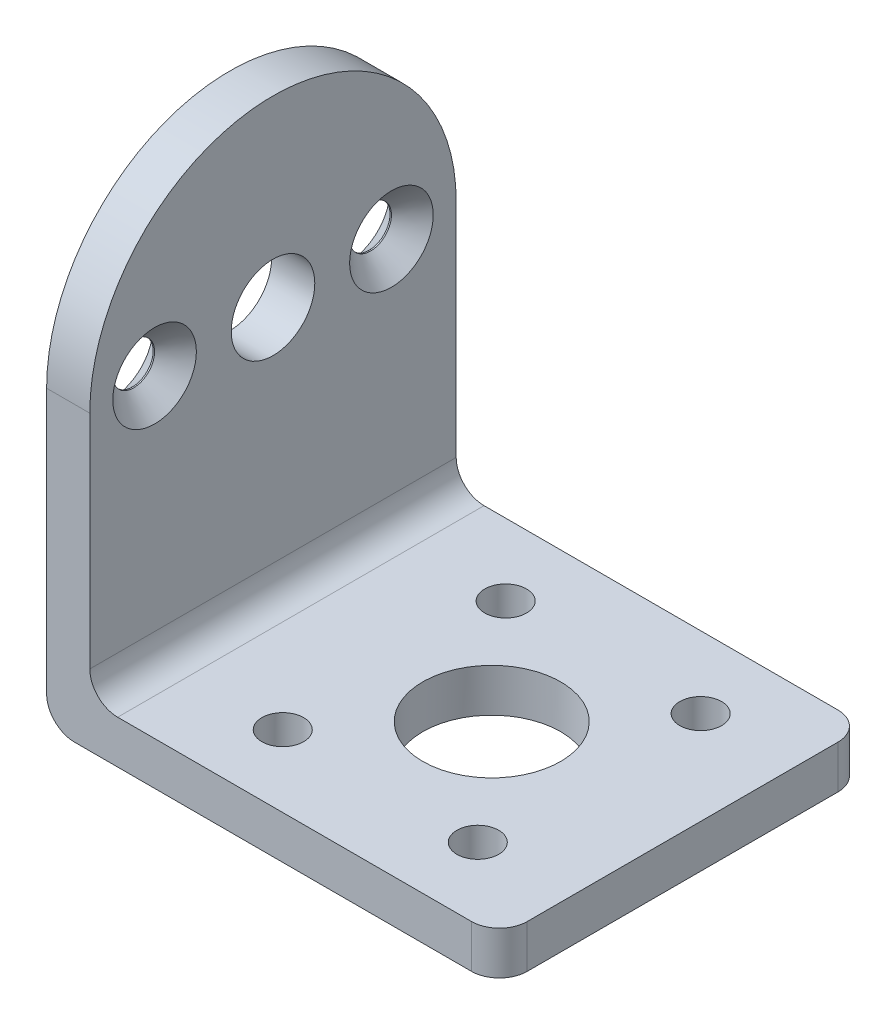
ISO-10303-21;
HEADER;
FILE_DESCRIPTION(('STEP AP214'),'2;1');
FILE_NAME('part.step','',(''),(''),'','','');
FILE_SCHEMA(('AUTOMOTIVE_DESIGN { 1 0 10303 214 1 1 1 1 }'));
ENDSEC;
DATA;
#1=APPLICATION_CONTEXT('core data for automotive mechanical design processes');
#2=APPLICATION_PROTOCOL_DEFINITION('international standard','automotive_design',2000,#1);
#3=PRODUCT_CONTEXT('',#1,'mechanical');
#4=PRODUCT('Part','Part','',(#3));
#5=PRODUCT_RELATED_PRODUCT_CATEGORY('part','',(#4));
#6=PRODUCT_DEFINITION_FORMATION('','',#4);
#7=PRODUCT_DEFINITION_CONTEXT('part definition',#1,'design');
#8=PRODUCT_DEFINITION('design','',#6,#7);
#9=PRODUCT_DEFINITION_SHAPE('','',#8);
#10=(LENGTH_UNIT() NAMED_UNIT(*) SI_UNIT(.MILLI.,.METRE.));
#11=(NAMED_UNIT(*) PLANE_ANGLE_UNIT() SI_UNIT($,.RADIAN.));
#12=(NAMED_UNIT(*) SI_UNIT($,.STERADIAN.) SOLID_ANGLE_UNIT());
#13=UNCERTAINTY_MEASURE_WITH_UNIT(LENGTH_MEASURE(1.E-05),#10,'distance_accuracy_value','');
#14=(GEOMETRIC_REPRESENTATION_CONTEXT(3) GLOBAL_UNCERTAINTY_ASSIGNED_CONTEXT((#13)) GLOBAL_UNIT_ASSIGNED_CONTEXT((#10,
#11,#12)) REPRESENTATION_CONTEXT('',''));
#15=CARTESIAN_POINT('',(0.,0.,0.));
#16=DIRECTION('',(0.,0.,1.));
#17=DIRECTION('',(1.,0.,0.));
#18=AXIS2_PLACEMENT_3D('',#15,#16,#17);
#19=CARTESIAN_POINT('',(0.,3.1,0.));
#20=DIRECTION('',(0.,-1.,0.));
#21=DIRECTION('',(0.,0.,-1.));
#22=AXIS2_PLACEMENT_3D('',#19,#20,#21);
#23=PLANE('',#22);
#24=CARTESIAN_POINT('',(11.8,3.1,-5.15));
#25=DIRECTION('',(0.,1.,0.));
#26=DIRECTION('',(0.,0.,1.));
#27=AXIS2_PLACEMENT_3D('',#24,#25,#26);
#28=CIRCLE('',#27,1.5);
#29=CARTESIAN_POINT('',(11.8,3.1,-3.65));
#30=VERTEX_POINT('',#29);
#31=EDGE_CURVE('E251',#30,#30,#28,.T.);
#32=ORIENTED_EDGE('',*,*,#31,.F.);
#33=EDGE_LOOP('',(#32));
#34=FACE_BOUND('',#33,.T.);
#35=CARTESIAN_POINT('',(25.8,3.1,-21.15));
#36=DIRECTION('',(0.,1.,0.));
#37=DIRECTION('',(0.,0.,1.));
#38=AXIS2_PLACEMENT_3D('',#35,#36,#37);
#39=CIRCLE('',#38,1.5);
#40=CARTESIAN_POINT('',(25.8,3.1,-19.65));
#41=VERTEX_POINT('',#40);
#42=EDGE_CURVE('E252',#41,#41,#39,.T.);
#43=ORIENTED_EDGE('',*,*,#42,.F.);
#44=EDGE_LOOP('',(#43));
#45=FACE_BOUND('',#44,.T.);
#46=CARTESIAN_POINT('',(18.8,3.1,-13.15));
#47=DIRECTION('',(0.,1.,0.));
#48=DIRECTION('',(0.,0.,1.));
#49=AXIS2_PLACEMENT_3D('',#46,#47,#48);
#50=CIRCLE('',#49,4.95);
#51=CARTESIAN_POINT('',(18.8,3.1,-8.2));
#52=VERTEX_POINT('',#51);
#53=EDGE_CURVE('E255',#52,#52,#50,.T.);
#54=ORIENTED_EDGE('',*,*,#53,.F.);
#55=EDGE_LOOP('',(#54));
#56=FACE_BOUND('',#55,.T.);
#57=CARTESIAN_POINT('',(25.8,3.1,-5.15));
#58=DIRECTION('',(0.,1.,0.));
#59=DIRECTION('',(0.,0.,1.));
#60=AXIS2_PLACEMENT_3D('',#57,#58,#59);
#61=CIRCLE('',#60,1.5);
#62=CARTESIAN_POINT('',(25.8,3.1,-3.65));
#63=VERTEX_POINT('',#62);
#64=EDGE_CURVE('E258',#63,#63,#61,.T.);
#65=ORIENTED_EDGE('',*,*,#64,.F.);
#66=EDGE_LOOP('',(#65));
#67=FACE_BOUND('',#66,.T.);
#68=CARTESIAN_POINT('',(11.8,3.1,-21.15));
#69=DIRECTION('',(0.,1.,0.));
#70=DIRECTION('',(0.,0.,1.));
#71=AXIS2_PLACEMENT_3D('',#68,#69,#70);
#72=CIRCLE('',#71,1.5);
#73=CARTESIAN_POINT('',(11.8,3.1,-19.65));
#74=VERTEX_POINT('',#73);
#75=EDGE_CURVE('E233',#74,#74,#72,.T.);
#76=ORIENTED_EDGE('',*,*,#75,.F.);
#77=EDGE_LOOP('',(#76));
#78=FACE_BOUND('',#77,.T.);
#79=DIRECTION('',(-1.,0.,0.));
#80=VECTOR('',#79,1.);
#81=CARTESIAN_POINT('',(0.,3.1,-26.3));
#82=LINE('',#81,#80);
#83=CARTESIAN_POINT('',(30.5,3.1,-26.3));
#84=VERTEX_POINT('',#83);
#85=CARTESIAN_POINT('',(5.09999999999999,3.1,-26.3));
#86=VERTEX_POINT('',#85);
#87=EDGE_CURVE('E166',#84,#86,#82,.T.);
#88=ORIENTED_EDGE('',*,*,#87,.T.);
#89=DIRECTION('',(0.,0.,-1.));
#90=VECTOR('',#89,1.);
#91=CARTESIAN_POINT('',(5.1,3.1,0.));
#92=LINE('',#91,#90);
#93=CARTESIAN_POINT('',(5.09999999999999,3.1,0.));
#94=VERTEX_POINT('',#93);
#95=EDGE_CURVE('E183',#86,#94,#92,.F.);
#96=ORIENTED_EDGE('',*,*,#95,.T.);
#97=DIRECTION('',(1.,0.,0.));
#98=VECTOR('',#97,1.);
#99=CARTESIAN_POINT('',(32.5,3.1,0.));
#100=LINE('',#99,#98);
#101=CARTESIAN_POINT('',(30.5,3.1,0.));
#102=VERTEX_POINT('',#101);
#103=EDGE_CURVE('E159',#94,#102,#100,.T.);
#104=ORIENTED_EDGE('',*,*,#103,.T.);
#105=CARTESIAN_POINT('',(30.5,3.1,-2.));
#106=DIRECTION('',(0.,-1.,0.));
#107=DIRECTION('',(0.,0.,-1.));
#108=AXIS2_PLACEMENT_3D('',#105,#106,#107);
#109=CIRCLE('',#108,2.);
#110=CARTESIAN_POINT('',(32.5,3.1,-2.));
#111=VERTEX_POINT('',#110);
#112=EDGE_CURVE('E179',#102,#111,#109,.F.);
#113=ORIENTED_EDGE('',*,*,#112,.T.);
#114=DIRECTION('',(0.,0.,-1.));
#115=VECTOR('',#114,1.);
#116=CARTESIAN_POINT('',(32.5,3.1,-26.3));
#117=LINE('',#116,#115);
#118=CARTESIAN_POINT('',(32.5,3.1,-24.3));
#119=VERTEX_POINT('',#118);
#120=EDGE_CURVE('E162',#111,#119,#117,.T.);
#121=ORIENTED_EDGE('',*,*,#120,.T.);
#122=CARTESIAN_POINT('',(30.5,3.1,-24.3));
#123=DIRECTION('',(0.,-1.,0.));
#124=DIRECTION('',(0.,0.,-1.));
#125=AXIS2_PLACEMENT_3D('',#122,#123,#124);
#126=CIRCLE('',#125,2.);
#127=EDGE_CURVE('E181',#119,#84,#126,.F.);
#128=ORIENTED_EDGE('',*,*,#127,.T.);
#129=EDGE_LOOP('',(#88,#96,#104,#113,#121,#128));
#130=FACE_BOUND('',#129,.T.);
#131=ADVANCED_FACE('F39',(#34,#45,#56,#67,#78,#130),#23,.F.);
#132=CARTESIAN_POINT('',(32.5,3.1,0.));
#133=DIRECTION('',(0.,0.,-1.));
#134=DIRECTION('',(-1.,0.,0.));
#135=AXIS2_PLACEMENT_3D('',#132,#133,#134);
#136=PLANE('',#135);
#137=DIRECTION('',(0.,-1.,0.));
#138=VECTOR('',#137,1.);
#139=CARTESIAN_POINT('',(0.,3.1,0.));
#140=LINE('',#139,#138);
#141=CARTESIAN_POINT('',(0.,21.,0.));
#142=VERTEX_POINT('',#141);
#143=CARTESIAN_POINT('',(0.,2.,0.));
#144=VERTEX_POINT('',#143);
#145=EDGE_CURVE('E169',#142,#144,#140,.T.);
#146=ORIENTED_EDGE('',*,*,#145,.T.);
#147=CARTESIAN_POINT('',(2.,2.,0.));
#148=DIRECTION('',(0.,0.,-1.));
#149=DIRECTION('',(-1.,0.,0.));
#150=AXIS2_PLACEMENT_3D('',#147,#148,#149);
#151=CIRCLE('',#150,2.);
#152=CARTESIAN_POINT('',(2.,0.,0.));
#153=VERTEX_POINT('',#152);
#154=EDGE_CURVE('E190',#144,#153,#151,.F.);
#155=ORIENTED_EDGE('',*,*,#154,.T.);
#156=DIRECTION('',(1.,0.,0.));
#157=VECTOR('',#156,1.);
#158=CARTESIAN_POINT('',(32.5,0.,0.));
#159=LINE('',#158,#157);
#160=CARTESIAN_POINT('',(30.5,0.,0.));
#161=VERTEX_POINT('',#160);
#162=EDGE_CURVE('E158',#153,#161,#159,.T.);
#163=ORIENTED_EDGE('',*,*,#162,.T.);
#164=DIRECTION('',(0.,-1.,0.));
#165=VECTOR('',#164,1.);
#166=CARTESIAN_POINT('',(30.5,3.1,0.));
#167=LINE('',#166,#165);
#168=EDGE_CURVE('E188',#161,#102,#167,.F.);
#169=ORIENTED_EDGE('',*,*,#168,.T.);
#170=ORIENTED_EDGE('',*,*,#103,.F.);
#171=CARTESIAN_POINT('',(5.1,5.1,0.));
#172=DIRECTION('',(0.,0.,-1.));
#173=DIRECTION('',(-1.,0.,0.));
#174=AXIS2_PLACEMENT_3D('',#171,#172,#173);
#175=CIRCLE('',#174,2.);
#176=CARTESIAN_POINT('',(3.1,5.10000000000001,0.));
#177=VERTEX_POINT('',#176);
#178=EDGE_CURVE('E207',#94,#177,#175,.T.);
#179=ORIENTED_EDGE('',*,*,#178,.T.);
#180=DIRECTION('',(0.,-1.,0.));
#181=VECTOR('',#180,1.);
#182=CARTESIAN_POINT('',(3.1,21.,0.));
#183=LINE('',#182,#181);
#184=CARTESIAN_POINT('',(3.1,21.,0.));
#185=VERTEX_POINT('',#184);
#186=EDGE_CURVE('E142',#185,#177,#183,.T.);
#187=ORIENTED_EDGE('',*,*,#186,.F.);
#188=DIRECTION('',(1.,0.,0.));
#189=VECTOR('',#188,1.);
#190=CARTESIAN_POINT('',(3.1,21.,0.));
#191=LINE('',#190,#189);
#192=EDGE_CURVE('E132',#142,#185,#191,.T.);
#193=ORIENTED_EDGE('',*,*,#192,.F.);
#194=EDGE_LOOP('',(#146,#155,#163,#169,#170,#179,#187,#193));
#195=FACE_BOUND('',#194,.T.);
#196=ADVANCED_FACE('F268',(#195),#136,.F.);
#197=CARTESIAN_POINT('',(32.5,3.1,-26.3));
#198=DIRECTION('',(-1.,0.,0.));
#199=DIRECTION('',(0.,0.,1.));
#200=AXIS2_PLACEMENT_3D('',#197,#198,#199);
#201=PLANE('',#200);
#202=DIRECTION('',(0.,0.,-1.));
#203=VECTOR('',#202,1.);
#204=CARTESIAN_POINT('',(32.5,0.,-26.3));
#205=LINE('',#204,#203);
#206=CARTESIAN_POINT('',(32.5,0.,-2.));
#207=VERTEX_POINT('',#206);
#208=CARTESIAN_POINT('',(32.5,0.,-24.3));
#209=VERTEX_POINT('',#208);
#210=EDGE_CURVE('E172',#207,#209,#205,.T.);
#211=ORIENTED_EDGE('',*,*,#210,.T.);
#212=DIRECTION('',(0.,-1.,0.));
#213=VECTOR('',#212,1.);
#214=CARTESIAN_POINT('',(32.5,3.1,-24.3));
#215=LINE('',#214,#213);
#216=EDGE_CURVE('E203',#209,#119,#215,.F.);
#217=ORIENTED_EDGE('',*,*,#216,.T.);
#218=ORIENTED_EDGE('',*,*,#120,.F.);
#219=DIRECTION('',(0.,-1.,0.));
#220=VECTOR('',#219,1.);
#221=CARTESIAN_POINT('',(32.5,3.1,-2.));
#222=LINE('',#221,#220);
#223=EDGE_CURVE('E201',#111,#207,#222,.T.);
#224=ORIENTED_EDGE('',*,*,#223,.T.);
#225=EDGE_LOOP('',(#211,#217,#218,#224));
#226=FACE_BOUND('',#225,.T.);
#227=ADVANCED_FACE('F288',(#226),#201,.F.);
#228=CARTESIAN_POINT('',(0.,3.1,-26.3));
#229=DIRECTION('',(0.,0.,1.));
#230=DIRECTION('',(1.,0.,0.));
#231=AXIS2_PLACEMENT_3D('',#228,#229,#230);
#232=PLANE('',#231);
#233=DIRECTION('',(-1.,0.,0.));
#234=VECTOR('',#233,1.);
#235=CARTESIAN_POINT('',(0.,0.,-26.3));
#236=LINE('',#235,#234);
#237=CARTESIAN_POINT('',(30.5,0.,-26.3));
#238=VERTEX_POINT('',#237);
#239=CARTESIAN_POINT('',(1.99999999999999,0.,-26.3));
#240=VERTEX_POINT('',#239);
#241=EDGE_CURVE('E163',#238,#240,#236,.T.);
#242=ORIENTED_EDGE('',*,*,#241,.T.);
#243=CARTESIAN_POINT('',(1.99999999999999,2.,-26.3));
#244=DIRECTION('',(0.,0.,1.));
#245=DIRECTION('',(1.,0.,0.));
#246=AXIS2_PLACEMENT_3D('',#243,#244,#245);
#247=CIRCLE('',#246,2.);
#248=CARTESIAN_POINT('',(0.,2.,-26.3));
#249=VERTEX_POINT('',#248);
#250=EDGE_CURVE('E199',#240,#249,#247,.F.);
#251=ORIENTED_EDGE('',*,*,#250,.T.);
#252=DIRECTION('',(0.,-1.,0.));
#253=VECTOR('',#252,1.);
#254=CARTESIAN_POINT('',(0.,3.1,-26.3));
#255=LINE('',#254,#253);
#256=CARTESIAN_POINT('',(0.,21.,-26.3));
#257=VERTEX_POINT('',#256);
#258=EDGE_CURVE('E127',#257,#249,#255,.T.);
#259=ORIENTED_EDGE('',*,*,#258,.F.);
#260=DIRECTION('',(-1.,0.,0.));
#261=VECTOR('',#260,1.);
#262=CARTESIAN_POINT('',(0.,21.,-26.3));
#263=LINE('',#262,#261);
#264=CARTESIAN_POINT('',(3.09999999999999,21.,-26.3));
#265=VERTEX_POINT('',#264);
#266=EDGE_CURVE('E121',#265,#257,#263,.T.);
#267=ORIENTED_EDGE('',*,*,#266,.F.);
#268=DIRECTION('',(0.,-1.,0.));
#269=VECTOR('',#268,1.);
#270=CARTESIAN_POINT('',(3.09999999999999,21.,-26.3));
#271=LINE('',#270,#269);
#272=CARTESIAN_POINT('',(3.09999999999999,5.10000000000001,-26.3));
#273=VERTEX_POINT('',#272);
#274=EDGE_CURVE('E125',#265,#273,#271,.T.);
#275=ORIENTED_EDGE('',*,*,#274,.T.);
#276=CARTESIAN_POINT('',(5.09999999999999,5.1,-26.3));
#277=DIRECTION('',(0.,0.,1.));
#278=DIRECTION('',(1.,0.,0.));
#279=AXIS2_PLACEMENT_3D('',#276,#277,#278);
#280=CIRCLE('',#279,2.);
#281=EDGE_CURVE('E205',#273,#86,#280,.T.);
#282=ORIENTED_EDGE('',*,*,#281,.T.);
#283=ORIENTED_EDGE('',*,*,#87,.F.);
#284=DIRECTION('',(0.,-1.,0.));
#285=VECTOR('',#284,1.);
#286=CARTESIAN_POINT('',(30.5,3.1,-26.3));
#287=LINE('',#286,#285);
#288=EDGE_CURVE('E196',#84,#238,#287,.T.);
#289=ORIENTED_EDGE('',*,*,#288,.T.);
#290=EDGE_LOOP('',(#242,#251,#259,#267,#275,#282,#283,#289));
#291=FACE_BOUND('',#290,.T.);
#292=ADVANCED_FACE('F124',(#291),#232,.F.);
#293=CARTESIAN_POINT('',(0.,3.1,0.));
#294=DIRECTION('',(1.,0.,0.));
#295=DIRECTION('',(0.,0.,-1.));
#296=AXIS2_PLACEMENT_3D('',#293,#294,#295);
#297=PLANE('',#296);
#298=CARTESIAN_POINT('',(0.,21.,-21.65));
#299=DIRECTION('',(1.,0.,0.));
#300=DIRECTION('',(0.,0.,-1.));
#301=AXIS2_PLACEMENT_3D('',#298,#299,#300);
#302=CIRCLE('',#301,2.99999999999998);
#303=CARTESIAN_POINT('',(0.,21.,-24.65));
#304=VERTEX_POINT('',#303);
#305=EDGE_CURVE('E212',#304,#304,#302,.T.);
#306=ORIENTED_EDGE('',*,*,#305,.T.);
#307=EDGE_LOOP('',(#306));
#308=FACE_BOUND('',#307,.T.);
#309=CARTESIAN_POINT('',(0.,21.,-4.65));
#310=DIRECTION('',(1.,0.,0.));
#311=DIRECTION('',(0.,0.,-1.));
#312=AXIS2_PLACEMENT_3D('',#309,#310,#311);
#313=CIRCLE('',#312,2.99999999999998);
#314=CARTESIAN_POINT('',(0.,21.,-7.64999999999998));
#315=VERTEX_POINT('',#314);
#316=EDGE_CURVE('E209',#315,#315,#313,.T.);
#317=ORIENTED_EDGE('',*,*,#316,.T.);
#318=EDGE_LOOP('',(#317));
#319=FACE_BOUND('',#318,.T.);
#320=CARTESIAN_POINT('',(0.,21.,-13.15));
#321=DIRECTION('',(1.,0.,0.));
#322=DIRECTION('',(0.,0.,-1.));
#323=AXIS2_PLACEMENT_3D('',#320,#321,#322);
#324=CIRCLE('',#323,3.);
#325=CARTESIAN_POINT('',(0.,21.,-16.15));
#326=VERTEX_POINT('',#325);
#327=EDGE_CURVE('E148',#326,#326,#324,.T.);
#328=ORIENTED_EDGE('',*,*,#327,.T.);
#329=EDGE_LOOP('',(#328));
#330=FACE_BOUND('',#329,.T.);
#331=ORIENTED_EDGE('',*,*,#258,.T.);
#332=DIRECTION('',(0.,0.,1.));
#333=VECTOR('',#332,1.);
#334=CARTESIAN_POINT('',(0.,2.,0.));
#335=LINE('',#334,#333);
#336=EDGE_CURVE('E185',#249,#144,#335,.T.);
#337=ORIENTED_EDGE('',*,*,#336,.T.);
#338=ORIENTED_EDGE('',*,*,#145,.F.);
#339=CARTESIAN_POINT('',(0.,21.,-13.15));
#340=DIRECTION('',(1.,0.,0.));
#341=DIRECTION('',(0.,0.,-1.));
#342=AXIS2_PLACEMENT_3D('',#339,#340,#341);
#343=CIRCLE('',#342,13.15);
#344=EDGE_CURVE('E147',#257,#142,#343,.T.);
#345=ORIENTED_EDGE('',*,*,#344,.F.);
#346=EDGE_LOOP('',(#331,#337,#338,#345));
#347=FACE_BOUND('',#346,.T.);
#348=ADVANCED_FACE('F298',(#308,#319,#330,#347),#297,.F.);
#349=CARTESIAN_POINT('',(0.,0.,0.));
#350=DIRECTION('',(0.,-1.,0.));
#351=DIRECTION('',(0.,0.,-1.));
#352=AXIS2_PLACEMENT_3D('',#349,#350,#351);
#353=PLANE('',#352);
#354=CARTESIAN_POINT('',(11.8,0.,-5.15));
#355=DIRECTION('',(0.,-1.,0.));
#356=DIRECTION('',(0.,0.,-1.));
#357=AXIS2_PLACEMENT_3D('',#354,#355,#356);
#358=CIRCLE('',#357,1.5);
#359=CARTESIAN_POINT('',(11.8,0.,-6.65));
#360=VERTEX_POINT('',#359);
#361=EDGE_CURVE('E44',#360,#360,#358,.T.);
#362=ORIENTED_EDGE('',*,*,#361,.F.);
#363=EDGE_LOOP('',(#362));
#364=FACE_BOUND('',#363,.T.);
#365=CARTESIAN_POINT('',(25.8,0.,-21.15));
#366=DIRECTION('',(0.,-1.,0.));
#367=DIRECTION('',(0.,0.,-1.));
#368=AXIS2_PLACEMENT_3D('',#365,#366,#367);
#369=CIRCLE('',#368,1.5);
#370=CARTESIAN_POINT('',(25.8,0.,-22.65));
#371=VERTEX_POINT('',#370);
#372=EDGE_CURVE('E238',#371,#371,#369,.T.);
#373=ORIENTED_EDGE('',*,*,#372,.F.);
#374=EDGE_LOOP('',(#373));
#375=FACE_BOUND('',#374,.T.);
#376=CARTESIAN_POINT('',(18.8,0.,-13.15));
#377=DIRECTION('',(0.,-1.,0.));
#378=DIRECTION('',(0.,0.,-1.));
#379=AXIS2_PLACEMENT_3D('',#376,#377,#378);
#380=CIRCLE('',#379,4.95);
#381=CARTESIAN_POINT('',(18.8,0.,-18.1));
#382=VERTEX_POINT('',#381);
#383=EDGE_CURVE('E236',#382,#382,#380,.T.);
#384=ORIENTED_EDGE('',*,*,#383,.F.);
#385=EDGE_LOOP('',(#384));
#386=FACE_BOUND('',#385,.T.);
#387=CARTESIAN_POINT('',(25.8,0.,-5.15));
#388=DIRECTION('',(0.,-1.,0.));
#389=DIRECTION('',(0.,0.,-1.));
#390=AXIS2_PLACEMENT_3D('',#387,#388,#389);
#391=CIRCLE('',#390,1.5);
#392=CARTESIAN_POINT('',(25.8,0.,-6.65));
#393=VERTEX_POINT('',#392);
#394=EDGE_CURVE('E232',#393,#393,#391,.T.);
#395=ORIENTED_EDGE('',*,*,#394,.F.);
#396=EDGE_LOOP('',(#395));
#397=FACE_BOUND('',#396,.T.);
#398=CARTESIAN_POINT('',(11.8,0.,-21.15));
#399=DIRECTION('',(0.,-1.,0.));
#400=DIRECTION('',(0.,0.,-1.));
#401=AXIS2_PLACEMENT_3D('',#398,#399,#400);
#402=CIRCLE('',#401,1.5);
#403=CARTESIAN_POINT('',(11.8,0.,-22.65));
#404=VERTEX_POINT('',#403);
#405=EDGE_CURVE('E229',#404,#404,#402,.T.);
#406=ORIENTED_EDGE('',*,*,#405,.F.);
#407=EDGE_LOOP('',(#406));
#408=FACE_BOUND('',#407,.T.);
#409=ORIENTED_EDGE('',*,*,#162,.F.);
#410=DIRECTION('',(0.,0.,1.));
#411=VECTOR('',#410,1.);
#412=CARTESIAN_POINT('',(1.99999999999999,0.,-26.3));
#413=LINE('',#412,#411);
#414=EDGE_CURVE('E194',#153,#240,#413,.F.);
#415=ORIENTED_EDGE('',*,*,#414,.T.);
#416=ORIENTED_EDGE('',*,*,#241,.F.);
#417=CARTESIAN_POINT('',(30.5,0.,-24.3));
#418=DIRECTION('',(0.,-1.,0.));
#419=DIRECTION('',(0.,0.,-1.));
#420=AXIS2_PLACEMENT_3D('',#417,#418,#419);
#421=CIRCLE('',#420,2.);
#422=EDGE_CURVE('E57',#238,#209,#421,.T.);
#423=ORIENTED_EDGE('',*,*,#422,.T.);
#424=ORIENTED_EDGE('',*,*,#210,.F.);
#425=CARTESIAN_POINT('',(30.5,0.,-2.));
#426=DIRECTION('',(0.,-1.,0.));
#427=DIRECTION('',(0.,0.,-1.));
#428=AXIS2_PLACEMENT_3D('',#425,#426,#427);
#429=CIRCLE('',#428,2.);
#430=EDGE_CURVE('E65',#207,#161,#429,.T.);
#431=ORIENTED_EDGE('',*,*,#430,.T.);
#432=EDGE_LOOP('',(#409,#415,#416,#423,#424,#431));
#433=FACE_BOUND('',#432,.T.);
#434=ADVANCED_FACE('F291',(#364,#375,#386,#397,#408,#433),#353,.T.);
#435=CARTESIAN_POINT('',(3.09999999999999,21.,-26.3));
#436=DIRECTION('',(-1.,0.,0.));
#437=DIRECTION('',(0.,0.,1.));
#438=AXIS2_PLACEMENT_3D('',#435,#436,#437);
#439=PLANE('',#438);
#440=CARTESIAN_POINT('',(3.09999999999999,21.,-21.65));
#441=DIRECTION('',(-1.,0.,0.));
#442=DIRECTION('',(0.,0.,1.));
#443=AXIS2_PLACEMENT_3D('',#440,#441,#442);
#444=CIRCLE('',#443,3.00000000000004);
#445=CARTESIAN_POINT('',(3.09999999999999,21.,-18.65));
#446=VERTEX_POINT('',#445);
#447=EDGE_CURVE('E11',#446,#446,#444,.T.);
#448=ORIENTED_EDGE('',*,*,#447,.T.);
#449=EDGE_LOOP('',(#448));
#450=FACE_BOUND('',#449,.T.);
#451=CARTESIAN_POINT('',(3.09999999999999,21.,-4.65));
#452=DIRECTION('',(-1.,0.,0.));
#453=DIRECTION('',(0.,0.,1.));
#454=AXIS2_PLACEMENT_3D('',#451,#452,#453);
#455=CIRCLE('',#454,3.00000000000004);
#456=CARTESIAN_POINT('',(3.1,21.,-1.64999999999996));
#457=VERTEX_POINT('',#456);
#458=EDGE_CURVE('E49',#457,#457,#455,.T.);
#459=ORIENTED_EDGE('',*,*,#458,.T.);
#460=EDGE_LOOP('',(#459));
#461=FACE_BOUND('',#460,.T.);
#462=CARTESIAN_POINT('',(3.09999999999999,21.,-13.15));
#463=DIRECTION('',(1.,0.,0.));
#464=DIRECTION('',(0.,0.,-1.));
#465=AXIS2_PLACEMENT_3D('',#462,#463,#464);
#466=CIRCLE('',#465,3.);
#467=CARTESIAN_POINT('',(3.09999999999999,21.,-16.15));
#468=VERTEX_POINT('',#467);
#469=EDGE_CURVE('E152',#468,#468,#466,.T.);
#470=ORIENTED_EDGE('',*,*,#469,.F.);
#471=EDGE_LOOP('',(#470));
#472=FACE_BOUND('',#471,.T.);
#473=ORIENTED_EDGE('',*,*,#186,.T.);
#474=DIRECTION('',(0.,0.,-1.));
#475=VECTOR('',#474,1.);
#476=CARTESIAN_POINT('',(3.09999999999999,5.1,-26.3));
#477=LINE('',#476,#475);
#478=EDGE_CURVE('E141',#177,#273,#477,.T.);
#479=ORIENTED_EDGE('',*,*,#478,.T.);
#480=ORIENTED_EDGE('',*,*,#274,.F.);
#481=CARTESIAN_POINT('',(3.09999999999999,21.,-13.15));
#482=DIRECTION('',(1.,0.,0.));
#483=DIRECTION('',(0.,0.,-1.));
#484=AXIS2_PLACEMENT_3D('',#481,#482,#483);
#485=CIRCLE('',#484,13.15);
#486=EDGE_CURVE('E139',#265,#185,#485,.T.);
#487=ORIENTED_EDGE('',*,*,#486,.T.);
#488=EDGE_LOOP('',(#473,#479,#480,#487));
#489=FACE_BOUND('',#488,.T.);
#490=ADVANCED_FACE('F138',(#450,#461,#472,#489),#439,.F.);
#491=CARTESIAN_POINT('',(0.,21.,-13.15));
#492=DIRECTION('',(1.,0.,0.));
#493=DIRECTION('',(0.,0.,-1.));
#494=AXIS2_PLACEMENT_3D('',#491,#492,#493);
#495=CYLINDRICAL_SURFACE('',#494,13.15);
#496=ORIENTED_EDGE('',*,*,#486,.F.);
#497=ORIENTED_EDGE('',*,*,#266,.T.);
#498=ORIENTED_EDGE('',*,*,#344,.T.);
#499=ORIENTED_EDGE('',*,*,#192,.T.);
#500=EDGE_LOOP('',(#496,#497,#498,#499));
#501=FACE_BOUND('',#500,.T.);
#502=ADVANCED_FACE('F145',(#501),#495,.T.);
#503=CARTESIAN_POINT('',(5.09999999999999,5.1,-26.3));
#504=DIRECTION('',(0.,0.,1.));
#505=DIRECTION('',(1.,0.,0.));
#506=AXIS2_PLACEMENT_3D('',#503,#504,#505);
#507=CYLINDRICAL_SURFACE('',#506,2.);
#508=ORIENTED_EDGE('',*,*,#178,.F.);
#509=ORIENTED_EDGE('',*,*,#95,.F.);
#510=ORIENTED_EDGE('',*,*,#281,.F.);
#511=ORIENTED_EDGE('',*,*,#478,.F.);
#512=EDGE_LOOP('',(#508,#509,#510,#511));
#513=FACE_BOUND('',#512,.T.);
#514=ADVANCED_FACE('F282',(#513),#507,.F.);
#515=CARTESIAN_POINT('',(2.,2.,0.));
#516=DIRECTION('',(0.,0.,-1.));
#517=DIRECTION('',(-1.,0.,0.));
#518=AXIS2_PLACEMENT_3D('',#515,#516,#517);
#519=CYLINDRICAL_SURFACE('',#518,2.);
#520=ORIENTED_EDGE('',*,*,#250,.F.);
#521=ORIENTED_EDGE('',*,*,#414,.F.);
#522=ORIENTED_EDGE('',*,*,#154,.F.);
#523=ORIENTED_EDGE('',*,*,#336,.F.);
#524=EDGE_LOOP('',(#520,#521,#522,#523));
#525=FACE_BOUND('',#524,.T.);
#526=ADVANCED_FACE('F296',(#525),#519,.T.);
#527=CARTESIAN_POINT('',(30.5,3.1,-24.3));
#528=DIRECTION('',(0.,-1.,0.));
#529=DIRECTION('',(0.,0.,-1.));
#530=AXIS2_PLACEMENT_3D('',#527,#528,#529);
#531=CYLINDRICAL_SURFACE('',#530,2.);
#532=ORIENTED_EDGE('',*,*,#127,.F.);
#533=ORIENTED_EDGE('',*,*,#216,.F.);
#534=ORIENTED_EDGE('',*,*,#422,.F.);
#535=ORIENTED_EDGE('',*,*,#288,.F.);
#536=EDGE_LOOP('',(#532,#533,#534,#535));
#537=FACE_BOUND('',#536,.T.);
#538=ADVANCED_FACE('F319',(#537),#531,.T.);
#539=CARTESIAN_POINT('',(30.5,3.1,-2.));
#540=DIRECTION('',(0.,-1.,0.));
#541=DIRECTION('',(0.,0.,-1.));
#542=AXIS2_PLACEMENT_3D('',#539,#540,#541);
#543=CYLINDRICAL_SURFACE('',#542,2.);
#544=ORIENTED_EDGE('',*,*,#112,.F.);
#545=ORIENTED_EDGE('',*,*,#168,.F.);
#546=ORIENTED_EDGE('',*,*,#430,.F.);
#547=ORIENTED_EDGE('',*,*,#223,.F.);
#548=EDGE_LOOP('',(#544,#545,#546,#547));
#549=FACE_BOUND('',#548,.T.);
#550=ADVANCED_FACE('F286',(#549),#543,.T.);
#551=CARTESIAN_POINT('',(0.,21.,-13.15));
#552=DIRECTION('',(1.,0.,0.));
#553=DIRECTION('',(0.,0.,-1.));
#554=AXIS2_PLACEMENT_3D('',#551,#552,#553);
#555=CYLINDRICAL_SURFACE('',#554,3.);
#556=CARTESIAN_POINT('',(0.,21.,-16.15));
#557=CARTESIAN_POINT('',(0.0322916666666598,21.,-16.15));
#558=CARTESIAN_POINT('',(0.0645833333333264,21.,-16.15));
#559=CARTESIAN_POINT('',(0.12916666666666,21.,-16.15));
#560=CARTESIAN_POINT('',(0.161458333333326,21.,-16.15));
#561=CARTESIAN_POINT('',(0.22604166666666,21.,-16.15));
#562=CARTESIAN_POINT('',(0.258333333333326,21.,-16.15));
#563=CARTESIAN_POINT('',(0.32291666666666,21.,-16.15));
#564=CARTESIAN_POINT('',(0.355208333333326,21.,-16.15));
#565=CARTESIAN_POINT('',(0.41979166666666,21.,-16.15));
#566=CARTESIAN_POINT('',(0.452083333333326,21.,-16.15));
#567=CARTESIAN_POINT('',(0.51666666666666,21.,-16.15));
#568=CARTESIAN_POINT('',(0.548958333333326,21.,-16.15));
#569=CARTESIAN_POINT('',(0.61354166666666,21.,-16.15));
#570=CARTESIAN_POINT('',(0.645833333333326,21.,-16.15));
#571=CARTESIAN_POINT('',(0.71041666666666,21.,-16.15));
#572=CARTESIAN_POINT('',(0.742708333333326,21.,-16.15));
#573=CARTESIAN_POINT('',(0.80729166666666,21.,-16.15));
#574=CARTESIAN_POINT('',(0.839583333333326,21.,-16.15));
#575=CARTESIAN_POINT('',(0.90416666666666,21.,-16.15));
#576=CARTESIAN_POINT('',(0.936458333333326,21.,-16.15));
#577=CARTESIAN_POINT('',(1.00104166666666,21.,-16.15));
#578=CARTESIAN_POINT('',(1.03333333333333,21.,-16.15));
#579=CARTESIAN_POINT('',(1.09791666666666,21.,-16.15));
#580=CARTESIAN_POINT('',(1.13020833333333,21.,-16.15));
#581=CARTESIAN_POINT('',(1.19479166666666,21.,-16.15));
#582=CARTESIAN_POINT('',(1.22708333333333,21.,-16.15));
#583=CARTESIAN_POINT('',(1.29166666666666,21.,-16.15));
#584=CARTESIAN_POINT('',(1.32395833333333,21.,-16.15));
#585=CARTESIAN_POINT('',(1.38854166666666,21.,-16.15));
#586=CARTESIAN_POINT('',(1.42083333333333,21.,-16.15));
#587=CARTESIAN_POINT('',(1.48541666666666,21.,-16.15));
#588=CARTESIAN_POINT('',(1.51770833333333,21.,-16.15));
#589=CARTESIAN_POINT('',(1.58229166666666,21.,-16.15));
#590=CARTESIAN_POINT('',(1.61458333333333,21.,-16.15));
#591=CARTESIAN_POINT('',(1.67916666666666,21.,-16.15));
#592=CARTESIAN_POINT('',(1.71145833333333,21.,-16.15));
#593=CARTESIAN_POINT('',(1.77604166666666,21.,-16.15));
#594=CARTESIAN_POINT('',(1.80833333333333,21.,-16.15));
#595=CARTESIAN_POINT('',(1.87291666666666,21.,-16.15));
#596=CARTESIAN_POINT('',(1.90520833333333,21.,-16.15));
#597=CARTESIAN_POINT('',(1.96979166666666,21.,-16.15));
#598=CARTESIAN_POINT('',(2.00208333333333,21.,-16.15));
#599=CARTESIAN_POINT('',(2.06666666666666,21.,-16.15));
#600=CARTESIAN_POINT('',(2.09895833333333,21.,-16.15));
#601=CARTESIAN_POINT('',(2.16354166666666,21.,-16.15));
#602=CARTESIAN_POINT('',(2.19583333333333,21.,-16.15));
#603=CARTESIAN_POINT('',(2.26041666666666,21.,-16.15));
#604=CARTESIAN_POINT('',(2.29270833333333,21.,-16.15));
#605=CARTESIAN_POINT('',(2.35729166666666,21.,-16.15));
#606=CARTESIAN_POINT('',(2.38958333333333,21.,-16.15));
#607=CARTESIAN_POINT('',(2.45416666666666,21.,-16.15));
#608=CARTESIAN_POINT('',(2.48645833333333,21.,-16.15));
#609=CARTESIAN_POINT('',(2.55104166666666,21.,-16.15));
#610=CARTESIAN_POINT('',(2.58333333333333,21.,-16.15));
#611=CARTESIAN_POINT('',(2.64791666666666,21.,-16.15));
#612=CARTESIAN_POINT('',(2.68020833333333,21.,-16.15));
#613=CARTESIAN_POINT('',(2.74479166666666,21.,-16.15));
#614=CARTESIAN_POINT('',(2.77708333333333,21.,-16.15));
#615=CARTESIAN_POINT('',(2.84166666666666,21.,-16.15));
#616=CARTESIAN_POINT('',(2.87395833333333,21.,-16.15));
#617=CARTESIAN_POINT('',(2.93854166666666,21.,-16.15));
#618=CARTESIAN_POINT('',(2.97083333333333,21.,-16.15));
#619=CARTESIAN_POINT('',(3.03541666666666,21.,-16.15));
#620=CARTESIAN_POINT('',(3.06770833333333,21.,-16.15));
#621=CARTESIAN_POINT('',(3.09999999999999,21.,-16.15));
#622=B_SPLINE_CURVE_WITH_KNOTS('',3,(#556,#557,#558,#559,#560,#561,#562,#563,#564,#565,#566,
#567,#568,#569,#570,#571,#572,#573,#574,#575,#576,#577,#578,#579,#580,#581,#582,#583,#584,#585,
#586,#587,#588,#589,#590,#591,#592,#593,#594,#595,#596,#597,#598,#599,#600,#601,#602,#603,#604,
#605,#606,#607,#608,#609,#610,#611,#612,#613,#614,#615,#616,#617,#618,#619,#620,#621),
.UNSPECIFIED.,.F.,.F.,(4,2,2,2,2,2,2,2,2,2,2,2,2,2,2,2,2,2,2,2,2,2,2,2,2,2,2,2,2,2,2,2,4),(0.,
0.096875,0.19375,0.290625,0.3875,0.484375,0.58125,0.678125,0.775,0.871875,0.96875,1.065625,
1.1625,1.259375,1.35625,1.453125,1.55,1.646875,1.74375,1.840625,1.9375,2.034375,2.13125,
2.228125,2.325,2.421875,2.51875,2.615625,2.7125,2.809375,2.90625,3.003125,3.1),.UNSPECIFIED.);
#623=EDGE_CURVE('BSEAM325',#326,#468,#622,.T.);
#624=ORIENTED_EDGE('',*,*,#327,.F.);
#625=ORIENTED_EDGE('',*,*,#469,.T.);
#626=ORIENTED_EDGE('',*,*,#623,.T.);
#627=ORIENTED_EDGE('',*,*,#623,.F.);
#628=EDGE_LOOP('',(#624,#626,#625,#627));
#629=FACE_BOUND('',#628,.T.);
#630=ADVANCED_FACE('F325',(#629),#555,.F.);
#631=CARTESIAN_POINT('',(0.,21.,-21.65));
#632=DIRECTION('',(1.,0.,0.));
#633=DIRECTION('',(0.,0.,-1.));
#634=AXIS2_PLACEMENT_3D('',#631,#632,#633);
#635=CYLINDRICAL_SURFACE('',#634,1.5);
#636=CARTESIAN_POINT('',(1.49999999999996,21.,-21.65));
#637=DIRECTION('',(1.,0.,0.));
#638=DIRECTION('',(0.,0.,-1.));
#639=AXIS2_PLACEMENT_3D('',#636,#637,#638);
#640=CIRCLE('',#639,1.5);
#641=CARTESIAN_POINT('',(1.49999999999996,21.,-23.15));
#642=VERTEX_POINT('',#641);
#643=EDGE_CURVE('E218',#642,#642,#640,.F.);
#644=CARTESIAN_POINT('',(1.59999999999995,21.,-21.65));
#645=DIRECTION('',(-1.,0.,0.));
#646=DIRECTION('',(0.,0.,1.));
#647=AXIS2_PLACEMENT_3D('',#644,#645,#646);
#648=CIRCLE('',#647,1.5);
#649=CARTESIAN_POINT('',(1.59999999999995,21.,-23.15));
#650=VERTEX_POINT('',#649);
#651=EDGE_CURVE('E215',#650,#650,#648,.F.);
#652=CARTESIAN_POINT('',(1.49999999999996,21.,-23.15));
#653=CARTESIAN_POINT('',(1.50104166666663,21.,-23.15));
#654=CARTESIAN_POINT('',(1.5020833333333,21.,-23.15));
#655=CARTESIAN_POINT('',(1.50416666666663,21.,-23.15));
#656=CARTESIAN_POINT('',(1.5052083333333,21.,-23.15));
#657=CARTESIAN_POINT('',(1.50729166666663,21.,-23.15));
#658=CARTESIAN_POINT('',(1.5083333333333,21.,-23.15));
#659=CARTESIAN_POINT('',(1.51041666666663,21.,-23.15));
#660=CARTESIAN_POINT('',(1.5114583333333,21.,-23.15));
#661=CARTESIAN_POINT('',(1.51354166666663,21.,-23.15));
#662=CARTESIAN_POINT('',(1.5145833333333,21.,-23.15));
#663=CARTESIAN_POINT('',(1.51666666666663,21.,-23.15));
#664=CARTESIAN_POINT('',(1.5177083333333,21.,-23.15));
#665=CARTESIAN_POINT('',(1.51979166666663,21.,-23.15));
#666=CARTESIAN_POINT('',(1.5208333333333,21.,-23.15));
#667=CARTESIAN_POINT('',(1.52291666666663,21.,-23.15));
#668=CARTESIAN_POINT('',(1.52395833333329,21.,-23.15));
#669=CARTESIAN_POINT('',(1.52604166666663,21.,-23.15));
#670=CARTESIAN_POINT('',(1.52708333333329,21.,-23.15));
#671=CARTESIAN_POINT('',(1.52916666666663,21.,-23.15));
#672=CARTESIAN_POINT('',(1.53020833333329,21.,-23.15));
#673=CARTESIAN_POINT('',(1.53229166666663,21.,-23.15));
#674=CARTESIAN_POINT('',(1.53333333333329,21.,-23.15));
#675=CARTESIAN_POINT('',(1.53541666666663,21.,-23.15));
#676=CARTESIAN_POINT('',(1.53645833333329,21.,-23.15));
#677=CARTESIAN_POINT('',(1.53854166666663,21.,-23.15));
#678=CARTESIAN_POINT('',(1.53958333333329,21.,-23.15));
#679=CARTESIAN_POINT('',(1.54166666666663,21.,-23.15));
#680=CARTESIAN_POINT('',(1.54270833333329,21.,-23.15));
#681=CARTESIAN_POINT('',(1.54479166666663,21.,-23.15));
#682=CARTESIAN_POINT('',(1.54583333333329,21.,-23.15));
#683=CARTESIAN_POINT('',(1.54791666666663,21.,-23.15));
#684=CARTESIAN_POINT('',(1.54895833333329,21.,-23.15));
#685=CARTESIAN_POINT('',(1.55104166666662,21.,-23.15));
#686=CARTESIAN_POINT('',(1.55208333333329,21.,-23.15));
#687=CARTESIAN_POINT('',(1.55416666666662,21.,-23.15));
#688=CARTESIAN_POINT('',(1.55520833333329,21.,-23.15));
#689=CARTESIAN_POINT('',(1.55729166666662,21.,-23.15));
#690=CARTESIAN_POINT('',(1.55833333333329,21.,-23.15));
#691=CARTESIAN_POINT('',(1.56041666666662,21.,-23.15));
#692=CARTESIAN_POINT('',(1.56145833333329,21.,-23.15));
#693=CARTESIAN_POINT('',(1.56354166666662,21.,-23.15));
#694=CARTESIAN_POINT('',(1.56458333333329,21.,-23.15));
#695=CARTESIAN_POINT('',(1.56666666666662,21.,-23.15));
#696=CARTESIAN_POINT('',(1.56770833333329,21.,-23.15));
#697=CARTESIAN_POINT('',(1.56979166666662,21.,-23.15));
#698=CARTESIAN_POINT('',(1.57083333333329,21.,-23.15));
#699=CARTESIAN_POINT('',(1.57291666666662,21.,-23.15));
#700=CARTESIAN_POINT('',(1.57395833333329,21.,-23.15));
#701=CARTESIAN_POINT('',(1.57604166666662,21.,-23.15));
#702=CARTESIAN_POINT('',(1.57708333333329,21.,-23.15));
#703=CARTESIAN_POINT('',(1.57916666666662,21.,-23.15));
#704=CARTESIAN_POINT('',(1.58020833333329,21.,-23.15));
#705=CARTESIAN_POINT('',(1.58229166666662,21.,-23.15));
#706=CARTESIAN_POINT('',(1.58333333333329,21.,-23.15));
#707=CARTESIAN_POINT('',(1.58541666666662,21.,-23.15));
#708=CARTESIAN_POINT('',(1.58645833333329,21.,-23.15));
#709=CARTESIAN_POINT('',(1.58854166666662,21.,-23.15));
#710=CARTESIAN_POINT('',(1.58958333333329,21.,-23.15));
#711=CARTESIAN_POINT('',(1.59166666666662,21.,-23.15));
#712=CARTESIAN_POINT('',(1.59270833333329,21.,-23.15));
#713=CARTESIAN_POINT('',(1.59479166666662,21.,-23.15));
#714=CARTESIAN_POINT('',(1.59583333333329,21.,-23.15));
#715=CARTESIAN_POINT('',(1.59791666666662,21.,-23.15));
#716=CARTESIAN_POINT('',(1.59895833333329,21.,-23.15));
#717=CARTESIAN_POINT('',(1.59999999999995,21.,-23.15));
#718=B_SPLINE_CURVE_WITH_KNOTS('',3,(#652,#653,#654,#655,#656,#657,#658,#659,#660,#661,#662,
#663,#664,#665,#666,#667,#668,#669,#670,#671,#672,#673,#674,#675,#676,#677,#678,#679,#680,#681,
#682,#683,#684,#685,#686,#687,#688,#689,#690,#691,#692,#693,#694,#695,#696,#697,#698,#699,#700,
#701,#702,#703,#704,#705,#706,#707,#708,#709,#710,#711,#712,#713,#714,#715,#716,#717),
.UNSPECIFIED.,.F.,.F.,(4,2,2,2,2,2,2,2,2,2,2,2,2,2,2,2,2,2,2,2,2,2,2,2,2,2,2,2,2,2,2,2,4),(0.,
0.00312499999999966,0.00624999999999931,0.00937499999999875,0.0124999999999984,
0.0156249999999981,0.0187499999999975,0.0218749999999972,0.0249999999999968,0.0281249999999965,
0.0312499999999961,0.0343749999999956,0.0374999999999952,0.0406249999999949,0.0437499999999943,
0.046874999999994,0.0499999999999936,0.0531249999999933,0.0562499999999929,0.0593749999999924,
0.062499999999992,0.0656249999999917,0.0687499999999911,0.0718749999999908,0.0749999999999904,
0.0781249999999901,0.0812499999999897,0.0843749999999892,0.0874999999999889,0.0906249999999885,
0.0937499999999879,0.0968749999999876,0.0999999999999873),.UNSPECIFIED.);
#719=EDGE_CURVE('BSEAM355',#642,#650,#718,.T.);
#720=ORIENTED_EDGE('',*,*,#643,.T.);
#721=ORIENTED_EDGE('',*,*,#651,.T.);
#722=ORIENTED_EDGE('',*,*,#719,.T.);
#723=ORIENTED_EDGE('',*,*,#719,.F.);
#724=EDGE_LOOP('',(#720,#722,#721,#723));
#725=FACE_BOUND('',#724,.T.);
#726=ADVANCED_FACE('F355',(#725),#635,.F.);
#727=CARTESIAN_POINT('',(0.,21.,-4.65));
#728=DIRECTION('',(1.,0.,0.));
#729=DIRECTION('',(0.,0.,-1.));
#730=AXIS2_PLACEMENT_3D('',#727,#728,#729);
#731=CYLINDRICAL_SURFACE('',#730,1.5);
#732=CARTESIAN_POINT('',(1.49999999999998,21.,-4.65));
#733=DIRECTION('',(1.,0.,0.));
#734=DIRECTION('',(0.,0.,-1.));
#735=AXIS2_PLACEMENT_3D('',#732,#733,#734);
#736=CIRCLE('',#735,1.5);
#737=CARTESIAN_POINT('',(1.49999999999998,21.,-6.15));
#738=VERTEX_POINT('',#737);
#739=EDGE_CURVE('E224',#738,#738,#736,.F.);
#740=CARTESIAN_POINT('',(1.59999999999997,21.,-4.65));
#741=DIRECTION('',(-1.,0.,0.));
#742=DIRECTION('',(0.,0.,1.));
#743=AXIS2_PLACEMENT_3D('',#740,#741,#742);
#744=CIRCLE('',#743,1.5);
#745=CARTESIAN_POINT('',(1.59999999999997,21.,-6.15));
#746=VERTEX_POINT('',#745);
#747=EDGE_CURVE('E221',#746,#746,#744,.F.);
#748=CARTESIAN_POINT('',(1.49999999999998,21.,-6.15));
#749=CARTESIAN_POINT('',(1.50104166666665,21.,-6.15));
#750=CARTESIAN_POINT('',(1.50208333333331,21.,-6.15));
#751=CARTESIAN_POINT('',(1.50416666666665,21.,-6.15));
#752=CARTESIAN_POINT('',(1.50520833333331,21.,-6.15));
#753=CARTESIAN_POINT('',(1.50729166666665,21.,-6.15));
#754=CARTESIAN_POINT('',(1.50833333333331,21.,-6.15));
#755=CARTESIAN_POINT('',(1.51041666666664,21.,-6.15));
#756=CARTESIAN_POINT('',(1.51145833333331,21.,-6.15));
#757=CARTESIAN_POINT('',(1.51354166666664,21.,-6.15));
#758=CARTESIAN_POINT('',(1.51458333333331,21.,-6.15));
#759=CARTESIAN_POINT('',(1.51666666666664,21.,-6.15));
#760=CARTESIAN_POINT('',(1.51770833333331,21.,-6.15));
#761=CARTESIAN_POINT('',(1.51979166666664,21.,-6.15));
#762=CARTESIAN_POINT('',(1.52083333333331,21.,-6.15));
#763=CARTESIAN_POINT('',(1.52291666666664,21.,-6.15));
#764=CARTESIAN_POINT('',(1.52395833333331,21.,-6.15));
#765=CARTESIAN_POINT('',(1.52604166666664,21.,-6.15));
#766=CARTESIAN_POINT('',(1.52708333333331,21.,-6.15));
#767=CARTESIAN_POINT('',(1.52916666666664,21.,-6.15));
#768=CARTESIAN_POINT('',(1.53020833333331,21.,-6.15));
#769=CARTESIAN_POINT('',(1.53229166666664,21.,-6.15));
#770=CARTESIAN_POINT('',(1.53333333333331,21.,-6.15));
#771=CARTESIAN_POINT('',(1.53541666666664,21.,-6.15));
#772=CARTESIAN_POINT('',(1.53645833333331,21.,-6.15));
#773=CARTESIAN_POINT('',(1.53854166666664,21.,-6.15));
#774=CARTESIAN_POINT('',(1.53958333333331,21.,-6.15));
#775=CARTESIAN_POINT('',(1.54166666666664,21.,-6.15));
#776=CARTESIAN_POINT('',(1.54270833333331,21.,-6.15));
#777=CARTESIAN_POINT('',(1.54479166666664,21.,-6.15));
#778=CARTESIAN_POINT('',(1.54583333333331,21.,-6.15));
#779=CARTESIAN_POINT('',(1.54791666666664,21.,-6.15));
#780=CARTESIAN_POINT('',(1.54895833333331,21.,-6.15));
#781=CARTESIAN_POINT('',(1.55104166666664,21.,-6.15));
#782=CARTESIAN_POINT('',(1.55208333333331,21.,-6.15));
#783=CARTESIAN_POINT('',(1.55416666666664,21.,-6.15));
#784=CARTESIAN_POINT('',(1.55520833333331,21.,-6.15));
#785=CARTESIAN_POINT('',(1.55729166666664,21.,-6.15));
#786=CARTESIAN_POINT('',(1.55833333333331,21.,-6.15));
#787=CARTESIAN_POINT('',(1.56041666666664,21.,-6.15));
#788=CARTESIAN_POINT('',(1.56145833333331,21.,-6.15));
#789=CARTESIAN_POINT('',(1.56354166666664,21.,-6.15));
#790=CARTESIAN_POINT('',(1.56458333333331,21.,-6.15));
#791=CARTESIAN_POINT('',(1.56666666666664,21.,-6.15));
#792=CARTESIAN_POINT('',(1.5677083333333,21.,-6.15));
#793=CARTESIAN_POINT('',(1.56979166666664,21.,-6.15));
#794=CARTESIAN_POINT('',(1.5708333333333,21.,-6.15));
#795=CARTESIAN_POINT('',(1.57291666666664,21.,-6.15));
#796=CARTESIAN_POINT('',(1.5739583333333,21.,-6.15));
#797=CARTESIAN_POINT('',(1.57604166666664,21.,-6.15));
#798=CARTESIAN_POINT('',(1.5770833333333,21.,-6.15));
#799=CARTESIAN_POINT('',(1.57916666666664,21.,-6.15));
#800=CARTESIAN_POINT('',(1.5802083333333,21.,-6.15));
#801=CARTESIAN_POINT('',(1.58229166666664,21.,-6.15));
#802=CARTESIAN_POINT('',(1.5833333333333,21.,-6.15));
#803=CARTESIAN_POINT('',(1.58541666666664,21.,-6.15));
#804=CARTESIAN_POINT('',(1.5864583333333,21.,-6.15));
#805=CARTESIAN_POINT('',(1.58854166666664,21.,-6.15));
#806=CARTESIAN_POINT('',(1.5895833333333,21.,-6.15));
#807=CARTESIAN_POINT('',(1.59166666666664,21.,-6.15));
#808=CARTESIAN_POINT('',(1.5927083333333,21.,-6.15));
#809=CARTESIAN_POINT('',(1.59479166666664,21.,-6.15));
#810=CARTESIAN_POINT('',(1.5958333333333,21.,-6.15));
#811=CARTESIAN_POINT('',(1.59791666666663,21.,-6.15));
#812=CARTESIAN_POINT('',(1.5989583333333,21.,-6.15));
#813=CARTESIAN_POINT('',(1.59999999999997,21.,-6.15));
#814=B_SPLINE_CURVE_WITH_KNOTS('',3,(#748,#749,#750,#751,#752,#753,#754,#755,#756,#757,#758,
#759,#760,#761,#762,#763,#764,#765,#766,#767,#768,#769,#770,#771,#772,#773,#774,#775,#776,#777,
#778,#779,#780,#781,#782,#783,#784,#785,#786,#787,#788,#789,#790,#791,#792,#793,#794,#795,#796,
#797,#798,#799,#800,#801,#802,#803,#804,#805,#806,#807,#808,#809,#810,#811,#812,#813),
.UNSPECIFIED.,.F.,.F.,(4,2,2,2,2,2,2,2,2,2,2,2,2,2,2,2,2,2,2,2,2,2,2,2,2,2,2,2,2,2,2,2,4),(0.,
0.00312499999999966,0.00624999999999931,0.00937499999999897,0.0124999999999986,
0.0156249999999983,0.0187499999999979,0.0218749999999976,0.0249999999999972,0.0281249999999967,
0.0312499999999963,0.034374999999996,0.0374999999999957,0.0406249999999953,0.043749999999995,
0.0468749999999946,0.0499999999999943,0.0531249999999939,0.0562499999999936,0.0593749999999932,
0.0624999999999929,0.0656249999999926,0.0687499999999922,0.0718749999999919,0.0749999999999913,
0.078124999999991,0.0812499999999906,0.0843749999999903,0.0874999999999899,0.0906249999999896,
0.0937499999999892,0.0968749999999889,0.0999999999999886),.UNSPECIFIED.);
#815=EDGE_CURVE('BSEAM334',#738,#746,#814,.T.);
#816=ORIENTED_EDGE('',*,*,#739,.T.);
#817=ORIENTED_EDGE('',*,*,#747,.T.);
#818=ORIENTED_EDGE('',*,*,#815,.T.);
#819=ORIENTED_EDGE('',*,*,#815,.F.);
#820=EDGE_LOOP('',(#816,#818,#817,#819));
#821=FACE_BOUND('',#820,.T.);
#822=ADVANCED_FACE('F334',(#821),#731,.F.);
#823=CARTESIAN_POINT('',(0.,21.,-21.65));
#824=DIRECTION('',(-1.,0.,0.));
#825=DIRECTION('',(0.,0.,1.));
#826=AXIS2_PLACEMENT_3D('',#823,#824,#825);
#827=CONICAL_SURFACE('',#826,2.99999999999998,0.78539816339745);
#828=ORIENTED_EDGE('',*,*,#643,.F.);
#829=EDGE_LOOP('',(#828));
#830=FACE_BOUND('',#829,.T.);
#831=ORIENTED_EDGE('',*,*,#305,.F.);
#832=EDGE_LOOP('',(#831));
#833=FACE_BOUND('',#832,.T.);
#834=ADVANCED_FACE('F327',(#830,#833),#827,.F.);
#835=CARTESIAN_POINT('',(0.,21.,-4.65));
#836=DIRECTION('',(-1.,0.,0.));
#837=DIRECTION('',(0.,0.,1.));
#838=AXIS2_PLACEMENT_3D('',#835,#836,#837);
#839=CONICAL_SURFACE('',#838,2.99999999999998,0.785398163397448);
#840=ORIENTED_EDGE('',*,*,#739,.F.);
#841=EDGE_LOOP('',(#840));
#842=FACE_BOUND('',#841,.T.);
#843=ORIENTED_EDGE('',*,*,#316,.F.);
#844=EDGE_LOOP('',(#843));
#845=FACE_BOUND('',#844,.T.);
#846=ADVANCED_FACE('F333',(#842,#845),#839,.F.);
#847=CARTESIAN_POINT('',(1.59999999999995,21.,-21.65));
#848=DIRECTION('',(1.,0.,0.));
#849=DIRECTION('',(0.,0.,-1.));
#850=AXIS2_PLACEMENT_3D('',#847,#848,#849);
#851=CONICAL_SURFACE('',#850,1.5,0.785398163397447);
#852=ORIENTED_EDGE('',*,*,#447,.F.);
#853=EDGE_LOOP('',(#852));
#854=FACE_BOUND('',#853,.T.);
#855=ORIENTED_EDGE('',*,*,#651,.F.);
#856=EDGE_LOOP('',(#855));
#857=FACE_BOUND('',#856,.T.);
#858=ADVANCED_FACE('F340',(#854,#857),#851,.F.);
#859=CARTESIAN_POINT('',(1.59999999999997,21.,-4.65));
#860=DIRECTION('',(1.,0.,0.));
#861=DIRECTION('',(0.,0.,-1.));
#862=AXIS2_PLACEMENT_3D('',#859,#860,#861);
#863=CONICAL_SURFACE('',#862,1.5,0.785398163397451);
#864=ORIENTED_EDGE('',*,*,#458,.F.);
#865=EDGE_LOOP('',(#864));
#866=FACE_BOUND('',#865,.T.);
#867=ORIENTED_EDGE('',*,*,#747,.F.);
#868=EDGE_LOOP('',(#867));
#869=FACE_BOUND('',#868,.T.);
#870=ADVANCED_FACE('F42',(#866,#869),#863,.F.);
#871=CARTESIAN_POINT('',(11.8,-21.9,-21.15));
#872=DIRECTION('',(0.,1.,0.));
#873=DIRECTION('',(0.,0.,1.));
#874=AXIS2_PLACEMENT_3D('',#871,#872,#873);
#875=CYLINDRICAL_SURFACE('',#874,1.5);
#876=ORIENTED_EDGE('',*,*,#405,.T.);
#877=EDGE_LOOP('',(#876));
#878=FACE_BOUND('',#877,.T.);
#879=ORIENTED_EDGE('',*,*,#75,.T.);
#880=EDGE_LOOP('',(#879));
#881=FACE_BOUND('',#880,.T.);
#882=ADVANCED_FACE('F349',(#878,#881),#875,.F.);
#883=CARTESIAN_POINT('',(25.8,-21.9,-5.15));
#884=DIRECTION('',(0.,1.,0.));
#885=DIRECTION('',(0.,0.,1.));
#886=AXIS2_PLACEMENT_3D('',#883,#884,#885);
#887=CYLINDRICAL_SURFACE('',#886,1.5);
#888=ORIENTED_EDGE('',*,*,#394,.T.);
#889=EDGE_LOOP('',(#888));
#890=FACE_BOUND('',#889,.T.);
#891=ORIENTED_EDGE('',*,*,#64,.T.);
#892=EDGE_LOOP('',(#891));
#893=FACE_BOUND('',#892,.T.);
#894=ADVANCED_FACE('F490',(#890,#893),#887,.F.);
#895=CARTESIAN_POINT('',(18.8,-21.9,-13.15));
#896=DIRECTION('',(0.,1.,0.));
#897=DIRECTION('',(0.,0.,1.));
#898=AXIS2_PLACEMENT_3D('',#895,#896,#897);
#899=CYLINDRICAL_SURFACE('',#898,4.95);
#900=ORIENTED_EDGE('',*,*,#383,.T.);
#901=EDGE_LOOP('',(#900));
#902=FACE_BOUND('',#901,.T.);
#903=ORIENTED_EDGE('',*,*,#53,.T.);
#904=EDGE_LOOP('',(#903));
#905=FACE_BOUND('',#904,.T.);
#906=ADVANCED_FACE('F264',(#902,#905),#899,.F.);
#907=CARTESIAN_POINT('',(25.8,-21.9,-21.15));
#908=DIRECTION('',(0.,1.,0.));
#909=DIRECTION('',(0.,0.,1.));
#910=AXIS2_PLACEMENT_3D('',#907,#908,#909);
#911=CYLINDRICAL_SURFACE('',#910,1.5);
#912=ORIENTED_EDGE('',*,*,#372,.T.);
#913=EDGE_LOOP('',(#912));
#914=FACE_BOUND('',#913,.T.);
#915=ORIENTED_EDGE('',*,*,#42,.T.);
#916=EDGE_LOOP('',(#915));
#917=FACE_BOUND('',#916,.T.);
#918=ADVANCED_FACE('F508',(#914,#917),#911,.F.);
#919=CARTESIAN_POINT('',(11.8,-21.9,-5.15));
#920=DIRECTION('',(0.,1.,0.));
#921=DIRECTION('',(0.,0.,1.));
#922=AXIS2_PLACEMENT_3D('',#919,#920,#921);
#923=CYLINDRICAL_SURFACE('',#922,1.5);
#924=ORIENTED_EDGE('',*,*,#361,.T.);
#925=EDGE_LOOP('',(#924));
#926=FACE_BOUND('',#925,.T.);
#927=ORIENTED_EDGE('',*,*,#31,.T.);
#928=EDGE_LOOP('',(#927));
#929=FACE_BOUND('',#928,.T.);
#930=ADVANCED_FACE('F518',(#926,#929),#923,.F.);
#931=CLOSED_SHELL('',(#131,#196,#227,#292,#348,#434,#490,#502,#514,#526,#538,#550,#630,#726,
#822,#834,#846,#858,#870,#882,#894,#906,#918,#930));
#932=MANIFOLD_SOLID_BREP('B2',#931);
#933=ADVANCED_BREP_SHAPE_REPRESENTATION('',(#18,#932),#14);
#934=SHAPE_DEFINITION_REPRESENTATION(#9,#933);
ENDSEC;
END-ISO-10303-21;
